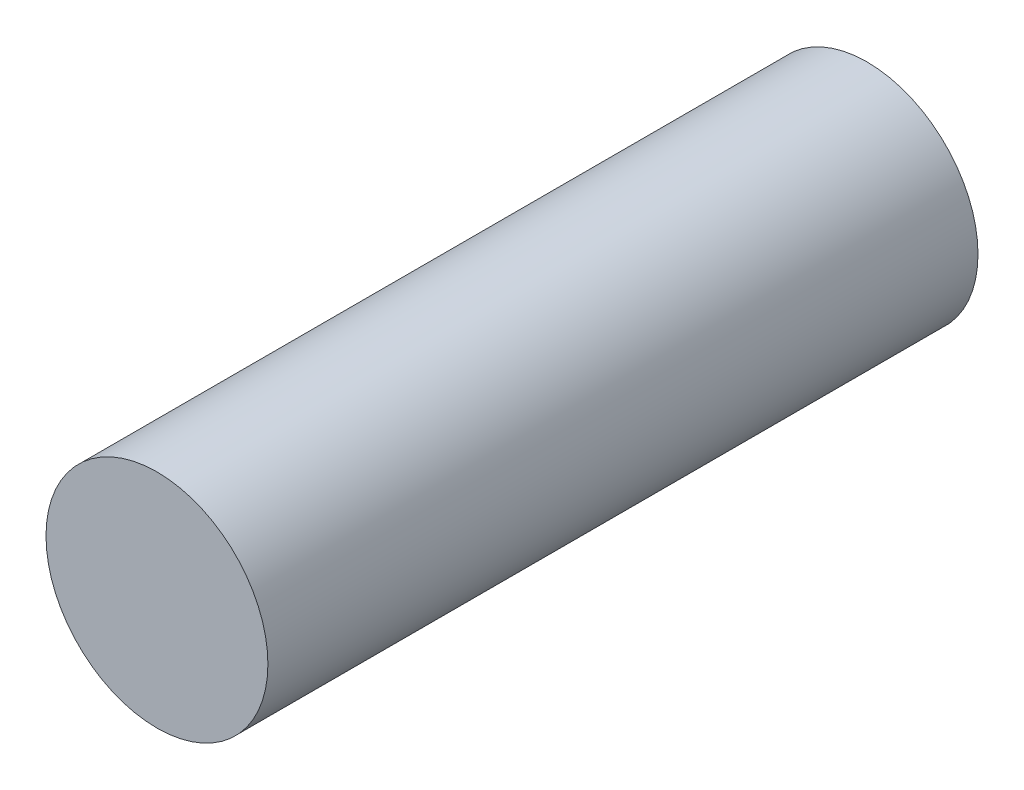
ISO-10303-21;
HEADER;
FILE_DESCRIPTION(('STEP AP214'),'2;1');
FILE_NAME('part.step','',(''),(''),'','','');
FILE_SCHEMA(('AUTOMOTIVE_DESIGN { 1 0 10303 214 1 1 1 1 }'));
ENDSEC;
DATA;
#1=APPLICATION_CONTEXT('core data for automotive mechanical design processes');
#2=APPLICATION_PROTOCOL_DEFINITION('international standard','automotive_design',2000,#1);
#3=PRODUCT_CONTEXT('',#1,'mechanical');
#4=PRODUCT('Part','Part','',(#3));
#5=PRODUCT_RELATED_PRODUCT_CATEGORY('part','',(#4));
#6=PRODUCT_DEFINITION_FORMATION('','',#4);
#7=PRODUCT_DEFINITION_CONTEXT('part definition',#1,'design');
#8=PRODUCT_DEFINITION('design','',#6,#7);
#9=PRODUCT_DEFINITION_SHAPE('','',#8);
#10=(LENGTH_UNIT() NAMED_UNIT(*) SI_UNIT(.MILLI.,.METRE.));
#11=(NAMED_UNIT(*) PLANE_ANGLE_UNIT() SI_UNIT($,.RADIAN.));
#12=(NAMED_UNIT(*) SI_UNIT($,.STERADIAN.) SOLID_ANGLE_UNIT());
#13=UNCERTAINTY_MEASURE_WITH_UNIT(LENGTH_MEASURE(1.E-05),#10,'distance_accuracy_value','');
#14=(GEOMETRIC_REPRESENTATION_CONTEXT(3) GLOBAL_UNCERTAINTY_ASSIGNED_CONTEXT((#13)) GLOBAL_UNIT_ASSIGNED_CONTEXT((#10,
#11,#12)) REPRESENTATION_CONTEXT('',''));
#15=CARTESIAN_POINT('',(0.,0.,0.));
#16=DIRECTION('',(0.,0.,1.));
#17=DIRECTION('',(1.,0.,0.));
#18=AXIS2_PLACEMENT_3D('',#15,#16,#17);
#19=CARTESIAN_POINT('',(1.25000004,0.,0.));
#20=DIRECTION('',(0.,0.,-1.));
#21=DIRECTION('',(-1.,0.,0.));
#22=AXIS2_PLACEMENT_3D('',#19,#20,#21);
#23=PLANE('',#22);
#24=CARTESIAN_POINT('',(0.,0.,0.));
#25=DIRECTION('',(0.,0.,-1.));
#26=DIRECTION('',(-1.,0.,0.));
#27=AXIS2_PLACEMENT_3D('',#24,#25,#26);
#28=CIRCLE('',#27,1.25000004);
#29=CARTESIAN_POINT('',(-1.25000004,0.,0.));
#30=VERTEX_POINT('',#29);
#31=EDGE_CURVE('E18',#30,#30,#28,.F.);
#32=ORIENTED_EDGE('',*,*,#31,.F.);
#33=EDGE_LOOP('',(#32));
#34=FACE_BOUND('',#33,.T.);
#35=ADVANCED_FACE('F15',(#34),#23,.T.);
#36=CARTESIAN_POINT('',(1.25000004,0.,7.99999924));
#37=DIRECTION('',(0.,0.,-1.));
#38=DIRECTION('',(-1.,0.,0.));
#39=AXIS2_PLACEMENT_3D('',#36,#37,#38);
#40=PLANE('',#39);
#41=CARTESIAN_POINT('',(0.,0.,7.99999924));
#42=DIRECTION('',(0.,0.,-1.));
#43=DIRECTION('',(-1.,0.,0.));
#44=AXIS2_PLACEMENT_3D('',#41,#42,#43);
#45=CIRCLE('',#44,1.25000004);
#46=CARTESIAN_POINT('',(-1.25000004,0.,7.99999924));
#47=VERTEX_POINT('',#46);
#48=EDGE_CURVE('E10',#47,#47,#45,.T.);
#49=ORIENTED_EDGE('',*,*,#48,.F.);
#50=EDGE_LOOP('',(#49));
#51=FACE_BOUND('',#50,.T.);
#52=ADVANCED_FACE('F30',(#51),#40,.F.);
#53=CARTESIAN_POINT('',(0.,0.,0.));
#54=DIRECTION('',(0.,0.,-1.));
#55=DIRECTION('',(-1.,0.,0.));
#56=AXIS2_PLACEMENT_3D('',#53,#54,#55);
#57=CYLINDRICAL_SURFACE('',#56,1.25000004);
#58=ORIENTED_EDGE('',*,*,#48,.T.);
#59=EDGE_LOOP('',(#58));
#60=FACE_BOUND('',#59,.T.);
#61=ORIENTED_EDGE('',*,*,#31,.T.);
#62=EDGE_LOOP('',(#61));
#63=FACE_BOUND('',#62,.T.);
#64=ADVANCED_FACE('F27',(#60,#63),#57,.T.);
#65=CLOSED_SHELL('',(#35,#52,#64));
#66=MANIFOLD_SOLID_BREP('B1',#65);
#67=ADVANCED_BREP_SHAPE_REPRESENTATION('',(#18,#66),#14);
#68=SHAPE_DEFINITION_REPRESENTATION(#9,#67);
ENDSEC;
END-ISO-10303-21;
